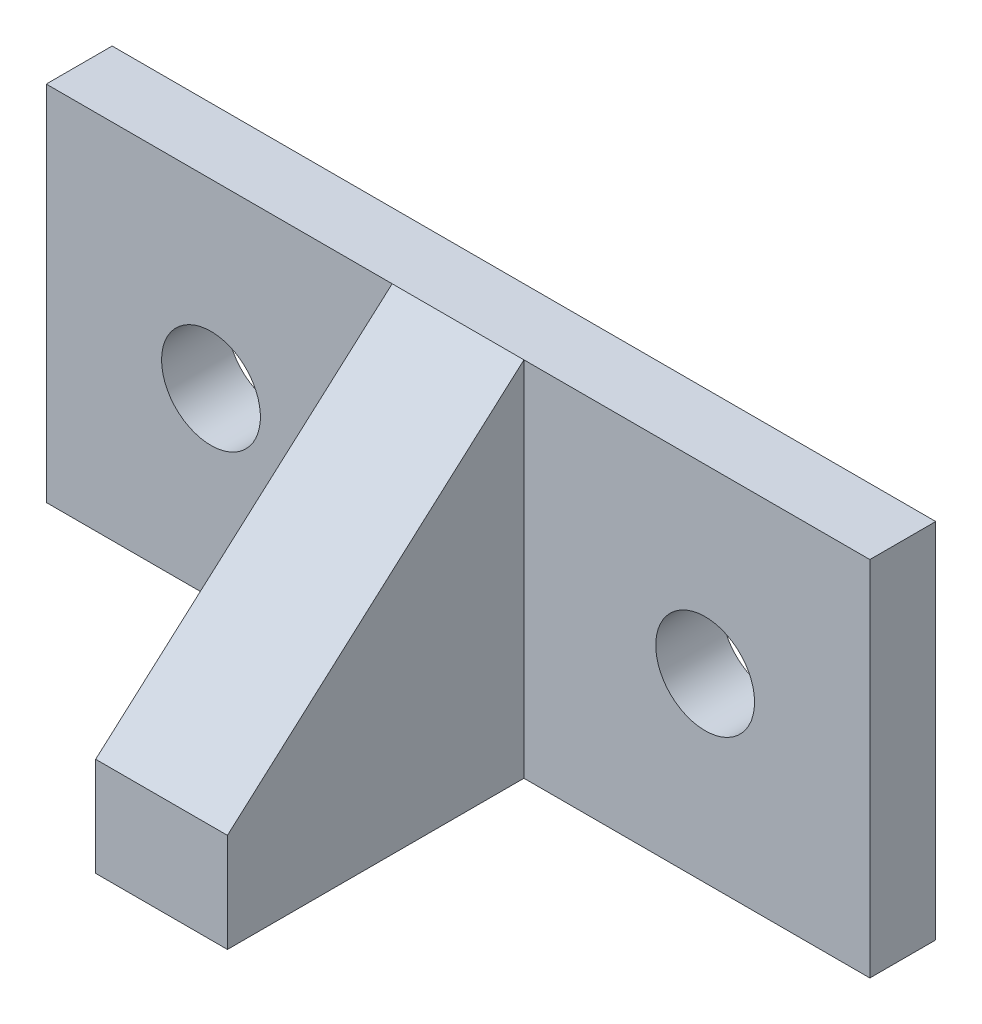
ISO-10303-21;
HEADER;
FILE_DESCRIPTION(('STEP AP214'),'2;1');
FILE_NAME('part.step','',(''),(''),'','','');
FILE_SCHEMA(('AUTOMOTIVE_DESIGN { 1 0 10303 214 1 1 1 1 }'));
ENDSEC;
DATA;
#1=APPLICATION_CONTEXT('core data for automotive mechanical design processes');
#2=APPLICATION_PROTOCOL_DEFINITION('international standard','automotive_design',2000,#1);
#3=PRODUCT_CONTEXT('',#1,'mechanical');
#4=PRODUCT('Part','Part','',(#3));
#5=PRODUCT_RELATED_PRODUCT_CATEGORY('part','',(#4));
#6=PRODUCT_DEFINITION_FORMATION('','',#4);
#7=PRODUCT_DEFINITION_CONTEXT('part definition',#1,'design');
#8=PRODUCT_DEFINITION('design','',#6,#7);
#9=PRODUCT_DEFINITION_SHAPE('','',#8);
#10=(LENGTH_UNIT() NAMED_UNIT(*) SI_UNIT(.MILLI.,.METRE.));
#11=(NAMED_UNIT(*) PLANE_ANGLE_UNIT() SI_UNIT($,.RADIAN.));
#12=(NAMED_UNIT(*) SI_UNIT($,.STERADIAN.) SOLID_ANGLE_UNIT());
#13=UNCERTAINTY_MEASURE_WITH_UNIT(LENGTH_MEASURE(1.E-05),#10,'distance_accuracy_value','');
#14=(GEOMETRIC_REPRESENTATION_CONTEXT(3) GLOBAL_UNCERTAINTY_ASSIGNED_CONTEXT((#13)) GLOBAL_UNIT_ASSIGNED_CONTEXT((#10,
#11,#12)) REPRESENTATION_CONTEXT('',''));
#15=CARTESIAN_POINT('',(0.,0.,0.));
#16=DIRECTION('',(0.,0.,1.));
#17=DIRECTION('',(1.,0.,0.));
#18=AXIS2_PLACEMENT_3D('',#15,#16,#17);
#19=CARTESIAN_POINT('',(62.5,0.,0.));
#20=DIRECTION('',(0.,0.,1.));
#21=DIRECTION('',(1.,0.,0.));
#22=AXIS2_PLACEMENT_3D('',#19,#20,#21);
#23=PLANE('',#22);
#24=CARTESIAN_POINT('',(-37.5,27.4999999999999,0.));
#25=DIRECTION('',(0.,0.,-1.));
#26=DIRECTION('',(-1.,0.,0.));
#27=AXIS2_PLACEMENT_3D('',#24,#25,#26);
#28=CIRCLE('',#27,7.5);
#29=CARTESIAN_POINT('',(-45.,27.4999999999999,0.));
#30=VERTEX_POINT('',#29);
#31=EDGE_CURVE('E226',#30,#30,#28,.T.);
#32=ORIENTED_EDGE('',*,*,#31,.T.);
#33=EDGE_LOOP('',(#32));
#34=FACE_BOUND('',#33,.T.);
#35=DIRECTION('',(-1.,0.,0.));
#36=VECTOR('',#35,1.);
#37=CARTESIAN_POINT('',(62.5,0.,0.));
#38=LINE('',#37,#36);
#39=CARTESIAN_POINT('',(-9.99999999999999,0.,0.));
#40=VERTEX_POINT('',#39);
#41=CARTESIAN_POINT('',(-62.5,0.,0.));
#42=VERTEX_POINT('',#41);
#43=EDGE_CURVE('E66',#40,#42,#38,.T.);
#44=ORIENTED_EDGE('',*,*,#43,.F.);
#45=DIRECTION('',(0.,1.,0.));
#46=VECTOR('',#45,1.);
#47=CARTESIAN_POINT('',(-10.,0.,0.));
#48=LINE('',#47,#46);
#49=CARTESIAN_POINT('',(-9.99999999999999,55.,0.));
#50=VERTEX_POINT('',#49);
#51=EDGE_CURVE('E61',#40,#50,#48,.T.);
#52=ORIENTED_EDGE('',*,*,#51,.T.);
#53=DIRECTION('',(-1.,0.,0.));
#54=VECTOR('',#53,1.);
#55=CARTESIAN_POINT('',(62.5,55.,0.));
#56=LINE('',#55,#54);
#57=CARTESIAN_POINT('',(-62.5,55.,0.));
#58=VERTEX_POINT('',#57);
#59=EDGE_CURVE('E179',#50,#58,#56,.T.);
#60=ORIENTED_EDGE('',*,*,#59,.T.);
#61=DIRECTION('',(0.,1.,0.));
#62=VECTOR('',#61,1.);
#63=CARTESIAN_POINT('',(-62.5,0.,0.));
#64=LINE('',#63,#62);
#65=EDGE_CURVE('E156',#42,#58,#64,.T.);
#66=ORIENTED_EDGE('',*,*,#65,.F.);
#67=EDGE_LOOP('',(#44,#52,#60,#66));
#68=FACE_BOUND('',#67,.T.);
#69=ADVANCED_FACE('F45',(#34,#68),#23,.T.);
#70=CARTESIAN_POINT('',(62.5,0.,0.));
#71=DIRECTION('',(0.,1.,0.));
#72=DIRECTION('',(0.,0.,1.));
#73=AXIS2_PLACEMENT_3D('',#70,#71,#72);
#74=PLANE('',#73);
#75=DIRECTION('',(0.,0.,-1.));
#76=VECTOR('',#75,1.);
#77=CARTESIAN_POINT('',(-62.5,0.,0.));
#78=LINE('',#77,#76);
#79=CARTESIAN_POINT('',(-62.5,0.,-10.));
#80=VERTEX_POINT('',#79);
#81=EDGE_CURVE('E139',#42,#80,#78,.T.);
#82=ORIENTED_EDGE('',*,*,#81,.T.);
#83=DIRECTION('',(-1.,0.,0.));
#84=VECTOR('',#83,1.);
#85=CARTESIAN_POINT('',(62.5,0.,-10.));
#86=LINE('',#85,#84);
#87=CARTESIAN_POINT('',(62.5,0.,-10.));
#88=VERTEX_POINT('',#87);
#89=EDGE_CURVE('E11',#88,#80,#86,.T.);
#90=ORIENTED_EDGE('',*,*,#89,.F.);
#91=DIRECTION('',(0.,0.,-1.));
#92=VECTOR('',#91,1.);
#93=CARTESIAN_POINT('',(62.5,0.,0.));
#94=LINE('',#93,#92);
#95=CARTESIAN_POINT('',(62.5,0.,0.));
#96=VERTEX_POINT('',#95);
#97=EDGE_CURVE('E151',#96,#88,#94,.T.);
#98=ORIENTED_EDGE('',*,*,#97,.F.);
#99=CARTESIAN_POINT('',(10.,0.,0.));
#100=VERTEX_POINT('',#99);
#101=EDGE_CURVE('E118',#96,#100,#38,.T.);
#102=ORIENTED_EDGE('',*,*,#101,.T.);
#103=DIRECTION('',(0.,0.,-1.));
#104=VECTOR('',#103,1.);
#105=CARTESIAN_POINT('',(10.,0.,0.));
#106=LINE('',#105,#104);
#107=CARTESIAN_POINT('',(10.,0.,45.));
#108=VERTEX_POINT('',#107);
#109=EDGE_CURVE('E111',#108,#100,#106,.T.);
#110=ORIENTED_EDGE('',*,*,#109,.F.);
#111=DIRECTION('',(-1.,0.,0.));
#112=VECTOR('',#111,1.);
#113=CARTESIAN_POINT('',(10.,0.,45.));
#114=LINE('',#113,#112);
#115=CARTESIAN_POINT('',(-10.,0.,45.));
#116=VERTEX_POINT('',#115);
#117=EDGE_CURVE('E115',#108,#116,#114,.T.);
#118=ORIENTED_EDGE('',*,*,#117,.T.);
#119=DIRECTION('',(0.,0.,-1.));
#120=VECTOR('',#119,1.);
#121=CARTESIAN_POINT('',(-10.,0.,0.));
#122=LINE('',#121,#120);
#123=EDGE_CURVE('E197',#116,#40,#122,.T.);
#124=ORIENTED_EDGE('',*,*,#123,.T.);
#125=ORIENTED_EDGE('',*,*,#43,.T.);
#126=EDGE_LOOP('',(#82,#90,#98,#102,#110,#118,#124,#125));
#127=FACE_BOUND('',#126,.T.);
#128=ADVANCED_FACE('F47',(#127),#74,.F.);
#129=CARTESIAN_POINT('',(62.5,0.,-10.));
#130=DIRECTION('',(0.,0.,1.));
#131=DIRECTION('',(1.,0.,0.));
#132=AXIS2_PLACEMENT_3D('',#129,#130,#131);
#133=PLANE('',#132);
#134=CARTESIAN_POINT('',(-37.5,27.4999999999999,-10.));
#135=DIRECTION('',(0.,0.,-1.));
#136=DIRECTION('',(-1.,0.,0.));
#137=AXIS2_PLACEMENT_3D('',#134,#135,#136);
#138=CIRCLE('',#137,7.5);
#139=CARTESIAN_POINT('',(-45.,27.4999999999999,-10.));
#140=VERTEX_POINT('',#139);
#141=EDGE_CURVE('E223',#140,#140,#138,.T.);
#142=ORIENTED_EDGE('',*,*,#141,.F.);
#143=EDGE_LOOP('',(#142));
#144=FACE_BOUND('',#143,.T.);
#145=CARTESIAN_POINT('',(37.5,27.4999999999999,-10.));
#146=DIRECTION('',(0.,0.,1.));
#147=DIRECTION('',(1.,0.,0.));
#148=AXIS2_PLACEMENT_3D('',#145,#146,#147);
#149=CIRCLE('',#148,7.5);
#150=CARTESIAN_POINT('',(45.,27.4999999999999,-10.));
#151=VERTEX_POINT('',#150);
#152=EDGE_CURVE('E214',#151,#151,#149,.T.);
#153=ORIENTED_EDGE('',*,*,#152,.T.);
#154=EDGE_LOOP('',(#153));
#155=FACE_BOUND('',#154,.T.);
#156=DIRECTION('',(0.,1.,0.));
#157=VECTOR('',#156,1.);
#158=CARTESIAN_POINT('',(-62.5,0.,-10.));
#159=LINE('',#158,#157);
#160=CARTESIAN_POINT('',(-62.5,55.,-10.));
#161=VERTEX_POINT('',#160);
#162=EDGE_CURVE('E144',#80,#161,#159,.T.);
#163=ORIENTED_EDGE('',*,*,#162,.T.);
#164=DIRECTION('',(-1.,0.,0.));
#165=VECTOR('',#164,1.);
#166=CARTESIAN_POINT('',(62.5,55.,-10.));
#167=LINE('',#166,#165);
#168=CARTESIAN_POINT('',(62.5,55.,-10.));
#169=VERTEX_POINT('',#168);
#170=EDGE_CURVE('E54',#169,#161,#167,.T.);
#171=ORIENTED_EDGE('',*,*,#170,.F.);
#172=DIRECTION('',(0.,1.,0.));
#173=VECTOR('',#172,1.);
#174=CARTESIAN_POINT('',(62.5,0.,-10.));
#175=LINE('',#174,#173);
#176=EDGE_CURVE('E155',#88,#169,#175,.T.);
#177=ORIENTED_EDGE('',*,*,#176,.F.);
#178=ORIENTED_EDGE('',*,*,#89,.T.);
#179=EDGE_LOOP('',(#163,#171,#177,#178));
#180=FACE_BOUND('',#179,.T.);
#181=ADVANCED_FACE('F189',(#144,#155,#180),#133,.F.);
#182=CARTESIAN_POINT('',(62.5,55.,0.));
#183=DIRECTION('',(0.,1.,0.));
#184=DIRECTION('',(0.,0.,1.));
#185=AXIS2_PLACEMENT_3D('',#182,#183,#184);
#186=PLANE('',#185);
#187=DIRECTION('',(0.,0.,-1.));
#188=VECTOR('',#187,1.);
#189=CARTESIAN_POINT('',(-62.5,55.,0.));
#190=LINE('',#189,#188);
#191=EDGE_CURVE('E170',#58,#161,#190,.T.);
#192=ORIENTED_EDGE('',*,*,#191,.F.);
#193=ORIENTED_EDGE('',*,*,#59,.F.);
#194=DIRECTION('',(-1.,0.,0.));
#195=VECTOR('',#194,1.);
#196=CARTESIAN_POINT('',(10.,55.,0.));
#197=LINE('',#196,#195);
#198=CARTESIAN_POINT('',(10.,55.,0.));
#199=VERTEX_POINT('',#198);
#200=EDGE_CURVE('E140',#199,#50,#197,.T.);
#201=ORIENTED_EDGE('',*,*,#200,.F.);
#202=CARTESIAN_POINT('',(62.5,55.,0.));
#203=VERTEX_POINT('',#202);
#204=EDGE_CURVE('E180',#203,#199,#56,.T.);
#205=ORIENTED_EDGE('',*,*,#204,.F.);
#206=DIRECTION('',(0.,0.,-1.));
#207=VECTOR('',#206,1.);
#208=CARTESIAN_POINT('',(62.5,55.,0.));
#209=LINE('',#208,#207);
#210=EDGE_CURVE('E159',#203,#169,#209,.T.);
#211=ORIENTED_EDGE('',*,*,#210,.T.);
#212=ORIENTED_EDGE('',*,*,#170,.T.);
#213=EDGE_LOOP('',(#192,#193,#201,#205,#211,#212));
#214=FACE_BOUND('',#213,.T.);
#215=ADVANCED_FACE('F186',(#214),#186,.T.);
#216=CARTESIAN_POINT('',(37.5,27.4999999999999,0.));
#217=DIRECTION('',(0.,0.,1.));
#218=DIRECTION('',(1.,0.,0.));
#219=AXIS2_PLACEMENT_3D('',#216,#217,#218);
#220=CIRCLE('',#219,7.5);
#221=CARTESIAN_POINT('',(45.,27.4999999999999,0.));
#222=VERTEX_POINT('',#221);
#223=EDGE_CURVE('E217',#222,#222,#220,.T.);
#224=ORIENTED_EDGE('',*,*,#223,.F.);
#225=EDGE_LOOP('',(#224));
#226=FACE_BOUND('',#225,.T.);
#227=DIRECTION('',(0.,1.,0.));
#228=VECTOR('',#227,1.);
#229=CARTESIAN_POINT('',(10.,0.,0.));
#230=LINE('',#229,#228);
#231=EDGE_CURVE('E122',#100,#199,#230,.T.);
#232=ORIENTED_EDGE('',*,*,#231,.F.);
#233=ORIENTED_EDGE('',*,*,#101,.F.);
#234=DIRECTION('',(0.,1.,0.));
#235=VECTOR('',#234,1.);
#236=CARTESIAN_POINT('',(62.5,0.,0.));
#237=LINE('',#236,#235);
#238=EDGE_CURVE('E163',#96,#203,#237,.T.);
#239=ORIENTED_EDGE('',*,*,#238,.T.);
#240=ORIENTED_EDGE('',*,*,#204,.T.);
#241=EDGE_LOOP('',(#232,#233,#239,#240));
#242=FACE_BOUND('',#241,.T.);
#243=ADVANCED_FACE('F243',(#226,#242),#23,.T.);
#244=CARTESIAN_POINT('',(62.5,0.,0.));
#245=DIRECTION('',(1.,0.,0.));
#246=DIRECTION('',(0.,0.,-1.));
#247=AXIS2_PLACEMENT_3D('',#244,#245,#246);
#248=PLANE('',#247);
#249=ORIENTED_EDGE('',*,*,#97,.T.);
#250=ORIENTED_EDGE('',*,*,#176,.T.);
#251=ORIENTED_EDGE('',*,*,#210,.F.);
#252=ORIENTED_EDGE('',*,*,#238,.F.);
#253=EDGE_LOOP('',(#249,#250,#251,#252));
#254=FACE_BOUND('',#253,.T.);
#255=ADVANCED_FACE('F253',(#254),#248,.T.);
#256=CARTESIAN_POINT('',(-62.5,0.,0.));
#257=DIRECTION('',(1.,0.,0.));
#258=DIRECTION('',(0.,0.,-1.));
#259=AXIS2_PLACEMENT_3D('',#256,#257,#258);
#260=PLANE('',#259);
#261=ORIENTED_EDGE('',*,*,#81,.F.);
#262=ORIENTED_EDGE('',*,*,#65,.T.);
#263=ORIENTED_EDGE('',*,*,#191,.T.);
#264=ORIENTED_EDGE('',*,*,#162,.F.);
#265=EDGE_LOOP('',(#261,#262,#263,#264));
#266=FACE_BOUND('',#265,.T.);
#267=ADVANCED_FACE('F193',(#266),#260,.F.);
#268=CARTESIAN_POINT('',(10.,0.,45.));
#269=DIRECTION('',(0.,0.,-1.));
#270=DIRECTION('',(-1.,0.,0.));
#271=AXIS2_PLACEMENT_3D('',#268,#269,#270);
#272=PLANE('',#271);
#273=DIRECTION('',(0.,-1.,0.));
#274=VECTOR('',#273,1.);
#275=CARTESIAN_POINT('',(-10.,0.,45.));
#276=LINE('',#275,#274);
#277=CARTESIAN_POINT('',(-10.,15.,45.));
#278=VERTEX_POINT('',#277);
#279=EDGE_CURVE('E137',#278,#116,#276,.T.);
#280=ORIENTED_EDGE('',*,*,#279,.T.);
#281=ORIENTED_EDGE('',*,*,#117,.F.);
#282=DIRECTION('',(0.,-1.,0.));
#283=VECTOR('',#282,1.);
#284=CARTESIAN_POINT('',(10.,0.,45.));
#285=LINE('',#284,#283);
#286=CARTESIAN_POINT('',(10.,15.,45.));
#287=VERTEX_POINT('',#286);
#288=EDGE_CURVE('E123',#287,#108,#285,.T.);
#289=ORIENTED_EDGE('',*,*,#288,.F.);
#290=DIRECTION('',(-1.,0.,0.));
#291=VECTOR('',#290,1.);
#292=CARTESIAN_POINT('',(10.,15.,45.));
#293=LINE('',#292,#291);
#294=EDGE_CURVE('E147',#287,#278,#293,.T.);
#295=ORIENTED_EDGE('',*,*,#294,.T.);
#296=EDGE_LOOP('',(#280,#281,#289,#295));
#297=FACE_BOUND('',#296,.T.);
#298=ADVANCED_FACE('F135',(#297),#272,.F.);
#299=CARTESIAN_POINT('',(10.,30.7241379310345,27.3103448275862));
#300=DIRECTION('',(0.,-0.74740931868366,-0.66436383882992));
#301=DIRECTION('',(0.,0.66436383882992,-0.74740931868366));
#302=AXIS2_PLACEMENT_3D('',#299,#300,#301);
#303=PLANE('',#302);
#304=DIRECTION('',(0.,-0.66436383882992,0.74740931868366));
#305=VECTOR('',#304,1.);
#306=CARTESIAN_POINT('',(-10.,30.7241379310345,27.3103448275862));
#307=LINE('',#306,#305);
#308=EDGE_CURVE('E133',#50,#278,#307,.T.);
#309=ORIENTED_EDGE('',*,*,#308,.T.);
#310=ORIENTED_EDGE('',*,*,#294,.F.);
#311=DIRECTION('',(0.,-0.66436383882992,0.74740931868366));
#312=VECTOR('',#311,1.);
#313=CARTESIAN_POINT('',(10.,30.7241379310345,27.3103448275862));
#314=LINE('',#313,#312);
#315=EDGE_CURVE('E128',#199,#287,#314,.T.);
#316=ORIENTED_EDGE('',*,*,#315,.F.);
#317=ORIENTED_EDGE('',*,*,#200,.T.);
#318=EDGE_LOOP('',(#309,#310,#316,#317));
#319=FACE_BOUND('',#318,.T.);
#320=ADVANCED_FACE('F264',(#319),#303,.F.);
#321=CARTESIAN_POINT('',(10.,0.,0.));
#322=DIRECTION('',(1.,0.,0.));
#323=DIRECTION('',(0.,0.,-1.));
#324=AXIS2_PLACEMENT_3D('',#321,#322,#323);
#325=PLANE('',#324);
#326=ORIENTED_EDGE('',*,*,#288,.T.);
#327=ORIENTED_EDGE('',*,*,#109,.T.);
#328=ORIENTED_EDGE('',*,*,#231,.T.);
#329=ORIENTED_EDGE('',*,*,#315,.T.);
#330=EDGE_LOOP('',(#326,#327,#328,#329));
#331=FACE_BOUND('',#330,.T.);
#332=ADVANCED_FACE('F126',(#331),#325,.T.);
#333=CARTESIAN_POINT('',(-10.,0.,0.));
#334=DIRECTION('',(1.,0.,0.));
#335=DIRECTION('',(0.,0.,-1.));
#336=AXIS2_PLACEMENT_3D('',#333,#334,#335);
#337=PLANE('',#336);
#338=ORIENTED_EDGE('',*,*,#279,.F.);
#339=ORIENTED_EDGE('',*,*,#308,.F.);
#340=ORIENTED_EDGE('',*,*,#51,.F.);
#341=ORIENTED_EDGE('',*,*,#123,.F.);
#342=EDGE_LOOP('',(#338,#339,#340,#341));
#343=FACE_BOUND('',#342,.T.);
#344=ADVANCED_FACE('F202',(#343),#337,.F.);
#345=CARTESIAN_POINT('',(37.5,27.4999999999999,-10.));
#346=DIRECTION('',(0.,0.,1.));
#347=DIRECTION('',(1.,0.,0.));
#348=AXIS2_PLACEMENT_3D('',#345,#346,#347);
#349=CYLINDRICAL_SURFACE('',#348,7.5);
#350=ORIENTED_EDGE('',*,*,#152,.F.);
#351=EDGE_LOOP('',(#350));
#352=FACE_BOUND('',#351,.T.);
#353=ORIENTED_EDGE('',*,*,#223,.T.);
#354=EDGE_LOOP('',(#353));
#355=FACE_BOUND('',#354,.T.);
#356=ADVANCED_FACE('F315',(#352,#355),#349,.F.);
#357=CARTESIAN_POINT('',(-37.5,27.4999999999999,-10.));
#358=DIRECTION('',(0.,0.,1.));
#359=DIRECTION('',(1.,0.,0.));
#360=AXIS2_PLACEMENT_3D('',#357,#358,#359);
#361=CYLINDRICAL_SURFACE('',#360,7.5);
#362=ORIENTED_EDGE('',*,*,#141,.T.);
#363=EDGE_LOOP('',(#362));
#364=FACE_BOUND('',#363,.T.);
#365=ORIENTED_EDGE('',*,*,#31,.F.);
#366=EDGE_LOOP('',(#365));
#367=FACE_BOUND('',#366,.T.);
#368=ADVANCED_FACE('F234',(#364,#367),#361,.F.);
#369=CLOSED_SHELL('',(#69,#128,#181,#215,#243,#255,#267,#298,#320,#332,#344,#356,#368));
#370=MANIFOLD_SOLID_BREP('B2',#369);
#371=ADVANCED_BREP_SHAPE_REPRESENTATION('',(#18,#370),#14);
#372=SHAPE_DEFINITION_REPRESENTATION(#9,#371);
ENDSEC;
END-ISO-10303-21;
